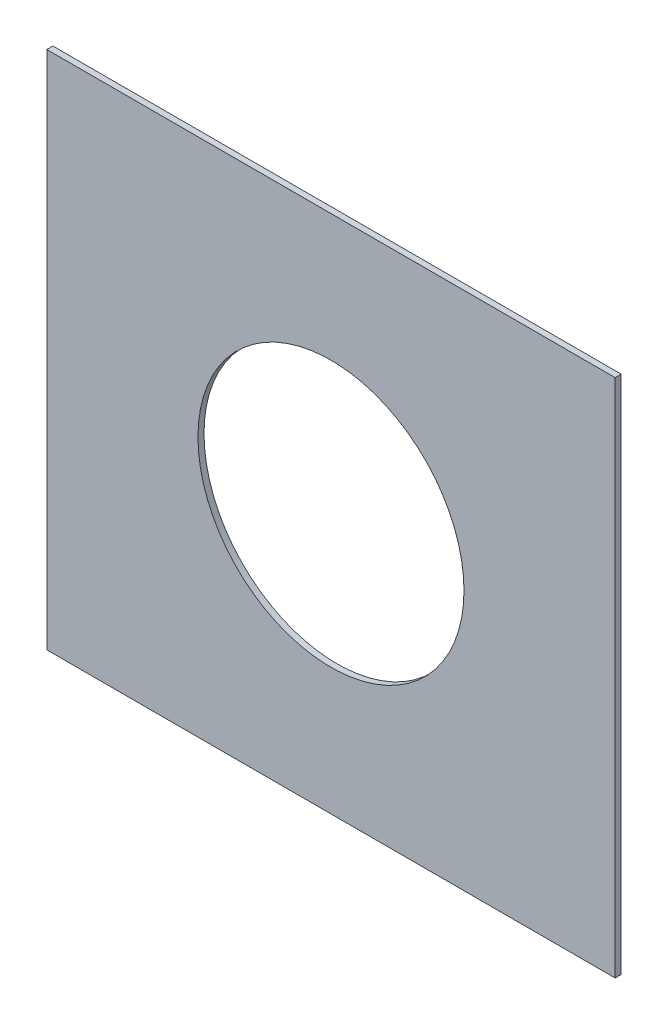
ISO-10303-21;
HEADER;
FILE_DESCRIPTION(('STEP AP214'),'2;1');
FILE_NAME('part.step','',(''),(''),'','','');
FILE_SCHEMA(('AUTOMOTIVE_DESIGN { 1 0 10303 214 1 1 1 1 }'));
ENDSEC;
DATA;
#1=APPLICATION_CONTEXT('core data for automotive mechanical design processes');
#2=APPLICATION_PROTOCOL_DEFINITION('international standard','automotive_design',2000,#1);
#3=PRODUCT_CONTEXT('',#1,'mechanical');
#4=PRODUCT('Part','Part','',(#3));
#5=PRODUCT_RELATED_PRODUCT_CATEGORY('part','',(#4));
#6=PRODUCT_DEFINITION_FORMATION('','',#4);
#7=PRODUCT_DEFINITION_CONTEXT('part definition',#1,'design');
#8=PRODUCT_DEFINITION('design','',#6,#7);
#9=PRODUCT_DEFINITION_SHAPE('','',#8);
#10=(LENGTH_UNIT() NAMED_UNIT(*) SI_UNIT(.MILLI.,.METRE.));
#11=(NAMED_UNIT(*) PLANE_ANGLE_UNIT() SI_UNIT($,.RADIAN.));
#12=(NAMED_UNIT(*) SI_UNIT($,.STERADIAN.) SOLID_ANGLE_UNIT());
#13=UNCERTAINTY_MEASURE_WITH_UNIT(LENGTH_MEASURE(1.E-05),#10,'distance_accuracy_value','');
#14=(GEOMETRIC_REPRESENTATION_CONTEXT(3) GLOBAL_UNCERTAINTY_ASSIGNED_CONTEXT((#13)) GLOBAL_UNIT_ASSIGNED_CONTEXT((#10,
#11,#12)) REPRESENTATION_CONTEXT('',''));
#15=CARTESIAN_POINT('',(0.,0.,0.));
#16=DIRECTION('',(0.,0.,1.));
#17=DIRECTION('',(1.,0.,0.));
#18=AXIS2_PLACEMENT_3D('',#15,#16,#17);
#19=CARTESIAN_POINT('',(1175.,-1075.,25.));
#20=DIRECTION('',(-1.,0.,0.));
#21=DIRECTION('',(0.,0.,1.));
#22=AXIS2_PLACEMENT_3D('',#19,#20,#21);
#23=PLANE('',#22);
#24=DIRECTION('',(0.,1.,0.));
#25=VECTOR('',#24,1.);
#26=CARTESIAN_POINT('',(1175.,-1075.,0.));
#27=LINE('',#26,#25);
#28=CARTESIAN_POINT('',(1175.,-1075.,0.));
#29=VERTEX_POINT('',#28);
#30=CARTESIAN_POINT('',(1175.,1075.,0.));
#31=VERTEX_POINT('',#30);
#32=EDGE_CURVE('E113',#29,#31,#27,.T.);
#33=ORIENTED_EDGE('',*,*,#32,.T.);
#34=DIRECTION('',(0.,0.,-1.));
#35=VECTOR('',#34,1.);
#36=CARTESIAN_POINT('',(1175.,1075.,25.));
#37=LINE('',#36,#35);
#38=CARTESIAN_POINT('',(1175.,1075.,25.));
#39=VERTEX_POINT('',#38);
#40=EDGE_CURVE('E11',#39,#31,#37,.T.);
#41=ORIENTED_EDGE('',*,*,#40,.F.);
#42=DIRECTION('',(0.,1.,0.));
#43=VECTOR('',#42,1.);
#44=CARTESIAN_POINT('',(1175.,-1075.,25.));
#45=LINE('',#44,#43);
#46=CARTESIAN_POINT('',(1175.,-1075.,25.));
#47=VERTEX_POINT('',#46);
#48=EDGE_CURVE('E97',#47,#39,#45,.T.);
#49=ORIENTED_EDGE('',*,*,#48,.F.);
#50=DIRECTION('',(0.,0.,-1.));
#51=VECTOR('',#50,1.);
#52=CARTESIAN_POINT('',(1175.,-1075.,25.));
#53=LINE('',#52,#51);
#54=EDGE_CURVE('E109',#47,#29,#53,.T.);
#55=ORIENTED_EDGE('',*,*,#54,.T.);
#56=EDGE_LOOP('',(#33,#41,#49,#55));
#57=FACE_BOUND('',#56,.T.);
#58=ADVANCED_FACE('F45',(#57),#23,.F.);
#59=CARTESIAN_POINT('',(-1175.,1075.,25.));
#60=DIRECTION('',(0.,-1.,0.));
#61=DIRECTION('',(0.,0.,-1.));
#62=AXIS2_PLACEMENT_3D('',#59,#60,#61);
#63=PLANE('',#62);
#64=DIRECTION('',(-1.,0.,0.));
#65=VECTOR('',#64,1.);
#66=CARTESIAN_POINT('',(-1175.,1075.,0.));
#67=LINE('',#66,#65);
#68=CARTESIAN_POINT('',(-1175.,1075.,0.));
#69=VERTEX_POINT('',#68);
#70=EDGE_CURVE('E102',#31,#69,#67,.T.);
#71=ORIENTED_EDGE('',*,*,#70,.T.);
#72=DIRECTION('',(0.,0.,-1.));
#73=VECTOR('',#72,1.);
#74=CARTESIAN_POINT('',(-1175.,1075.,25.));
#75=LINE('',#74,#73);
#76=CARTESIAN_POINT('',(-1175.,1075.,25.));
#77=VERTEX_POINT('',#76);
#78=EDGE_CURVE('E54',#77,#69,#75,.T.);
#79=ORIENTED_EDGE('',*,*,#78,.F.);
#80=DIRECTION('',(-1.,0.,0.));
#81=VECTOR('',#80,1.);
#82=CARTESIAN_POINT('',(-1175.,1075.,25.));
#83=LINE('',#82,#81);
#84=EDGE_CURVE('E92',#39,#77,#83,.T.);
#85=ORIENTED_EDGE('',*,*,#84,.F.);
#86=ORIENTED_EDGE('',*,*,#40,.T.);
#87=EDGE_LOOP('',(#71,#79,#85,#86));
#88=FACE_BOUND('',#87,.T.);
#89=ADVANCED_FACE('F101',(#88),#63,.F.);
#90=CARTESIAN_POINT('',(-1175.,-1075.,25.));
#91=DIRECTION('',(1.,0.,0.));
#92=DIRECTION('',(0.,0.,-1.));
#93=AXIS2_PLACEMENT_3D('',#90,#91,#92);
#94=PLANE('',#93);
#95=DIRECTION('',(0.,-1.,0.));
#96=VECTOR('',#95,1.);
#97=CARTESIAN_POINT('',(-1175.,-1075.,0.));
#98=LINE('',#97,#96);
#99=CARTESIAN_POINT('',(-1175.,-1075.,0.));
#100=VERTEX_POINT('',#99);
#101=EDGE_CURVE('E79',#69,#100,#98,.T.);
#102=ORIENTED_EDGE('',*,*,#101,.T.);
#103=DIRECTION('',(0.,0.,-1.));
#104=VECTOR('',#103,1.);
#105=CARTESIAN_POINT('',(-1175.,-1075.,25.));
#106=LINE('',#105,#104);
#107=CARTESIAN_POINT('',(-1175.,-1075.,25.));
#108=VERTEX_POINT('',#107);
#109=EDGE_CURVE('E104',#108,#100,#106,.T.);
#110=ORIENTED_EDGE('',*,*,#109,.F.);
#111=DIRECTION('',(0.,-1.,0.));
#112=VECTOR('',#111,1.);
#113=CARTESIAN_POINT('',(-1175.,-1075.,25.));
#114=LINE('',#113,#112);
#115=EDGE_CURVE('E95',#77,#108,#114,.T.);
#116=ORIENTED_EDGE('',*,*,#115,.F.);
#117=ORIENTED_EDGE('',*,*,#78,.T.);
#118=EDGE_LOOP('',(#102,#110,#116,#117));
#119=FACE_BOUND('',#118,.T.);
#120=ADVANCED_FACE('F105',(#119),#94,.F.);
#121=CARTESIAN_POINT('',(-1175.,-1075.,25.));
#122=DIRECTION('',(0.,1.,0.));
#123=DIRECTION('',(0.,0.,1.));
#124=AXIS2_PLACEMENT_3D('',#121,#122,#123);
#125=PLANE('',#124);
#126=DIRECTION('',(1.,0.,0.));
#127=VECTOR('',#126,1.);
#128=CARTESIAN_POINT('',(-1175.,-1075.,0.));
#129=LINE('',#128,#127);
#130=EDGE_CURVE('E85',#100,#29,#129,.T.);
#131=ORIENTED_EDGE('',*,*,#130,.T.);
#132=ORIENTED_EDGE('',*,*,#54,.F.);
#133=DIRECTION('',(1.,0.,0.));
#134=VECTOR('',#133,1.);
#135=CARTESIAN_POINT('',(-1175.,-1075.,25.));
#136=LINE('',#135,#134);
#137=EDGE_CURVE('E62',#108,#47,#136,.T.);
#138=ORIENTED_EDGE('',*,*,#137,.F.);
#139=ORIENTED_EDGE('',*,*,#109,.T.);
#140=EDGE_LOOP('',(#131,#132,#138,#139));
#141=FACE_BOUND('',#140,.T.);
#142=ADVANCED_FACE('F127',(#141),#125,.F.);
#143=CARTESIAN_POINT('',(0.,0.,25.));
#144=DIRECTION('',(0.,0.,-1.));
#145=DIRECTION('',(-1.,0.,0.));
#146=AXIS2_PLACEMENT_3D('',#143,#144,#145);
#147=PLANE('',#146);
#148=CARTESIAN_POINT('',(0.,0.,25.));
#149=DIRECTION('',(0.,0.,1.));
#150=DIRECTION('',(1.,0.,0.));
#151=AXIS2_PLACEMENT_3D('',#148,#149,#150);
#152=CIRCLE('',#151,550.);
#153=CARTESIAN_POINT('',(550.,0.,25.));
#154=VERTEX_POINT('',#153);
#155=EDGE_CURVE('E137',#154,#154,#152,.T.);
#156=ORIENTED_EDGE('',*,*,#155,.F.);
#157=EDGE_LOOP('',(#156));
#158=FACE_BOUND('',#157,.T.);
#159=ORIENTED_EDGE('',*,*,#48,.T.);
#160=ORIENTED_EDGE('',*,*,#84,.T.);
#161=ORIENTED_EDGE('',*,*,#115,.T.);
#162=ORIENTED_EDGE('',*,*,#137,.T.);
#163=EDGE_LOOP('',(#159,#160,#161,#162));
#164=FACE_BOUND('',#163,.T.);
#165=ADVANCED_FACE('F93',(#158,#164),#147,.F.);
#166=CARTESIAN_POINT('',(0.,0.,0.));
#167=DIRECTION('',(0.,0.,-1.));
#168=DIRECTION('',(-1.,0.,0.));
#169=AXIS2_PLACEMENT_3D('',#166,#167,#168);
#170=PLANE('',#169);
#171=CARTESIAN_POINT('',(0.,0.,0.));
#172=DIRECTION('',(0.,0.,-1.));
#173=DIRECTION('',(-1.,0.,0.));
#174=AXIS2_PLACEMENT_3D('',#171,#172,#173);
#175=CIRCLE('',#174,550.);
#176=CARTESIAN_POINT('',(-550.,0.,0.));
#177=VERTEX_POINT('',#176);
#178=EDGE_CURVE('E117',#177,#177,#175,.F.);
#179=ORIENTED_EDGE('',*,*,#178,.T.);
#180=EDGE_LOOP('',(#179));
#181=FACE_BOUND('',#180,.T.);
#182=ORIENTED_EDGE('',*,*,#32,.F.);
#183=ORIENTED_EDGE('',*,*,#130,.F.);
#184=ORIENTED_EDGE('',*,*,#101,.F.);
#185=ORIENTED_EDGE('',*,*,#70,.F.);
#186=EDGE_LOOP('',(#182,#183,#184,#185));
#187=FACE_BOUND('',#186,.T.);
#188=ADVANCED_FACE('F130',(#181,#187),#170,.T.);
#189=CARTESIAN_POINT('',(0.,0.,-1555.6349186104));
#190=DIRECTION('',(0.,0.,1.));
#191=DIRECTION('',(1.,0.,0.));
#192=AXIS2_PLACEMENT_3D('',#189,#190,#191);
#193=CYLINDRICAL_SURFACE('',#192,550.);
#194=ORIENTED_EDGE('',*,*,#155,.T.);
#195=EDGE_LOOP('',(#194));
#196=FACE_BOUND('',#195,.T.);
#197=ORIENTED_EDGE('',*,*,#178,.F.);
#198=EDGE_LOOP('',(#197));
#199=FACE_BOUND('',#198,.T.);
#200=ADVANCED_FACE('F142',(#196,#199),#193,.F.);
#201=CLOSED_SHELL('',(#58,#89,#120,#142,#165,#188,#200));
#202=MANIFOLD_SOLID_BREP('B2',#201);
#203=ADVANCED_BREP_SHAPE_REPRESENTATION('',(#18,#202),#14);
#204=SHAPE_DEFINITION_REPRESENTATION(#9,#203);
ENDSEC;
END-ISO-10303-21;
